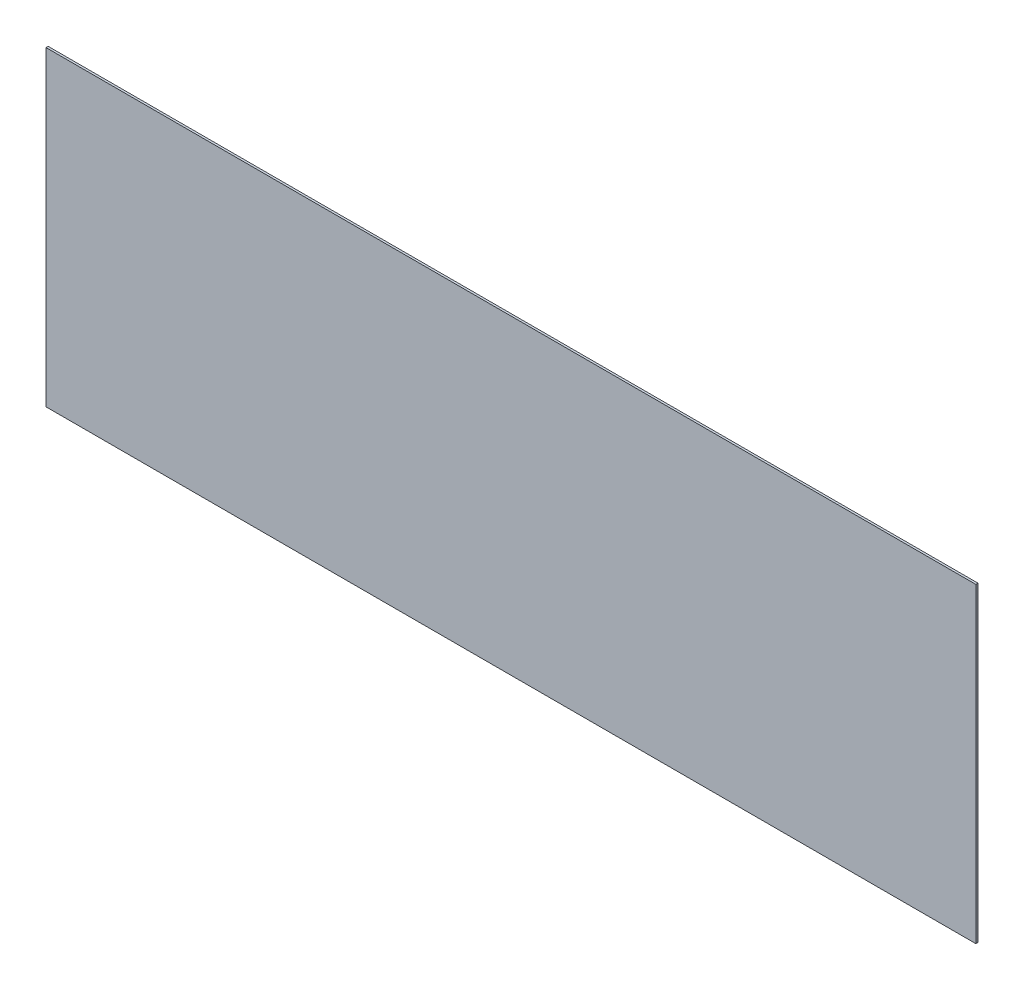
ISO-10303-21;
HEADER;
FILE_DESCRIPTION(('STEP AP214'),'2;1');
FILE_NAME('part.step','',(''),(''),'','','');
FILE_SCHEMA(('AUTOMOTIVE_DESIGN { 1 0 10303 214 1 1 1 1 }'));
ENDSEC;
DATA;
#1=APPLICATION_CONTEXT('core data for automotive mechanical design processes');
#2=APPLICATION_PROTOCOL_DEFINITION('international standard','automotive_design',2000,#1);
#3=PRODUCT_CONTEXT('',#1,'mechanical');
#4=PRODUCT('Part','Part','',(#3));
#5=PRODUCT_RELATED_PRODUCT_CATEGORY('part','',(#4));
#6=PRODUCT_DEFINITION_FORMATION('','',#4);
#7=PRODUCT_DEFINITION_CONTEXT('part definition',#1,'design');
#8=PRODUCT_DEFINITION('design','',#6,#7);
#9=PRODUCT_DEFINITION_SHAPE('','',#8);
#10=(LENGTH_UNIT() NAMED_UNIT(*) SI_UNIT(.MILLI.,.METRE.));
#11=(NAMED_UNIT(*) PLANE_ANGLE_UNIT() SI_UNIT($,.RADIAN.));
#12=(NAMED_UNIT(*) SI_UNIT($,.STERADIAN.) SOLID_ANGLE_UNIT());
#13=UNCERTAINTY_MEASURE_WITH_UNIT(LENGTH_MEASURE(1.E-05),#10,'distance_accuracy_value','');
#14=(GEOMETRIC_REPRESENTATION_CONTEXT(3) GLOBAL_UNCERTAINTY_ASSIGNED_CONTEXT((#13)) GLOBAL_UNIT_ASSIGNED_CONTEXT((#10,
#11,#12)) REPRESENTATION_CONTEXT('',''));
#15=CARTESIAN_POINT('',(0.,0.,0.));
#16=DIRECTION('',(0.,0.,1.));
#17=DIRECTION('',(1.,0.,0.));
#18=AXIS2_PLACEMENT_3D('',#15,#16,#17);
#19=CARTESIAN_POINT('',(650.,1070.,491.));
#20=DIRECTION('',(-1.,0.,0.));
#21=DIRECTION('',(0.,0.,1.));
#22=AXIS2_PLACEMENT_3D('',#19,#20,#21);
#23=PLANE('',#22);
#24=DIRECTION('',(0.,-1.,0.));
#25=VECTOR('',#24,1.);
#26=CARTESIAN_POINT('',(650.,1070.,494.));
#27=LINE('',#26,#25);
#28=CARTESIAN_POINT('',(650.,1070.,494.));
#29=VERTEX_POINT('',#28);
#30=CARTESIAN_POINT('',(650.,635.,494.000000000005));
#31=VERTEX_POINT('',#30);
#32=EDGE_CURVE('E97',#29,#31,#27,.T.);
#33=ORIENTED_EDGE('',*,*,#32,.T.);
#34=DIRECTION('',(0.,0.,1.));
#35=VECTOR('',#34,1.);
#36=CARTESIAN_POINT('',(650.,635.,491.000000000005));
#37=LINE('',#36,#35);
#38=CARTESIAN_POINT('',(650.,635.,491.000000000005));
#39=VERTEX_POINT('',#38);
#40=EDGE_CURVE('E11',#39,#31,#37,.T.);
#41=ORIENTED_EDGE('',*,*,#40,.F.);
#42=DIRECTION('',(0.,-1.,0.));
#43=VECTOR('',#42,1.);
#44=CARTESIAN_POINT('',(650.,1070.,491.));
#45=LINE('',#44,#43);
#46=CARTESIAN_POINT('',(650.,1070.,491.));
#47=VERTEX_POINT('',#46);
#48=EDGE_CURVE('E85',#47,#39,#45,.T.);
#49=ORIENTED_EDGE('',*,*,#48,.F.);
#50=DIRECTION('',(0.,0.,1.));
#51=VECTOR('',#50,1.);
#52=CARTESIAN_POINT('',(650.,1070.,491.));
#53=LINE('',#52,#51);
#54=EDGE_CURVE('E93',#47,#29,#53,.T.);
#55=ORIENTED_EDGE('',*,*,#54,.T.);
#56=EDGE_LOOP('',(#33,#41,#49,#55));
#57=FACE_BOUND('',#56,.T.);
#58=ADVANCED_FACE('F34',(#57),#23,.F.);
#59=CARTESIAN_POINT('',(650.,635.,491.000000000005));
#60=DIRECTION('',(0.,1.,0.));
#61=DIRECTION('',(0.,0.,1.));
#62=AXIS2_PLACEMENT_3D('',#59,#60,#61);
#63=PLANE('',#62);
#64=DIRECTION('',(-1.,0.,0.));
#65=VECTOR('',#64,1.);
#66=CARTESIAN_POINT('',(650.,635.,494.000000000005));
#67=LINE('',#66,#65);
#68=CARTESIAN_POINT('',(-650.000000000003,635.,494.000000000005));
#69=VERTEX_POINT('',#68);
#70=EDGE_CURVE('E89',#31,#69,#67,.T.);
#71=ORIENTED_EDGE('',*,*,#70,.T.);
#72=DIRECTION('',(0.,0.,1.));
#73=VECTOR('',#72,1.);
#74=CARTESIAN_POINT('',(-650.000000000003,635.,491.000000000005));
#75=LINE('',#74,#73);
#76=CARTESIAN_POINT('',(-650.000000000003,635.,491.000000000005));
#77=VERTEX_POINT('',#76);
#78=EDGE_CURVE('E42',#77,#69,#75,.T.);
#79=ORIENTED_EDGE('',*,*,#78,.F.);
#80=DIRECTION('',(-1.,0.,0.));
#81=VECTOR('',#80,1.);
#82=CARTESIAN_POINT('',(650.,635.,491.000000000005));
#83=LINE('',#82,#81);
#84=EDGE_CURVE('E80',#39,#77,#83,.T.);
#85=ORIENTED_EDGE('',*,*,#84,.F.);
#86=ORIENTED_EDGE('',*,*,#40,.T.);
#87=EDGE_LOOP('',(#71,#79,#85,#86));
#88=FACE_BOUND('',#87,.T.);
#89=ADVANCED_FACE('F88',(#88),#63,.F.);
#90=CARTESIAN_POINT('',(-650.000000000003,1070.,491.));
#91=DIRECTION('',(1.,0.,0.));
#92=DIRECTION('',(0.,0.,-1.));
#93=AXIS2_PLACEMENT_3D('',#90,#91,#92);
#94=PLANE('',#93);
#95=DIRECTION('',(0.,1.,0.));
#96=VECTOR('',#95,1.);
#97=CARTESIAN_POINT('',(-650.000000000003,1070.,494.));
#98=LINE('',#97,#96);
#99=CARTESIAN_POINT('',(-650.000000000003,1070.,494.));
#100=VERTEX_POINT('',#99);
#101=EDGE_CURVE('E67',#69,#100,#98,.T.);
#102=ORIENTED_EDGE('',*,*,#101,.T.);
#103=DIRECTION('',(0.,0.,1.));
#104=VECTOR('',#103,1.);
#105=CARTESIAN_POINT('',(-650.000000000003,1070.,491.));
#106=LINE('',#105,#104);
#107=CARTESIAN_POINT('',(-650.000000000003,1070.,491.));
#108=VERTEX_POINT('',#107);
#109=EDGE_CURVE('E90',#108,#100,#106,.T.);
#110=ORIENTED_EDGE('',*,*,#109,.F.);
#111=DIRECTION('',(0.,1.,0.));
#112=VECTOR('',#111,1.);
#113=CARTESIAN_POINT('',(-650.000000000003,1070.,491.));
#114=LINE('',#113,#112);
#115=EDGE_CURVE('E83',#77,#108,#114,.T.);
#116=ORIENTED_EDGE('',*,*,#115,.F.);
#117=ORIENTED_EDGE('',*,*,#78,.T.);
#118=EDGE_LOOP('',(#102,#110,#116,#117));
#119=FACE_BOUND('',#118,.T.);
#120=ADVANCED_FACE('F91',(#119),#94,.F.);
#121=CARTESIAN_POINT('',(650.,1070.,491.));
#122=DIRECTION('',(0.,-1.,0.));
#123=DIRECTION('',(0.,0.,-1.));
#124=AXIS2_PLACEMENT_3D('',#121,#122,#123);
#125=PLANE('',#124);
#126=DIRECTION('',(1.,0.,0.));
#127=VECTOR('',#126,1.);
#128=CARTESIAN_POINT('',(650.,1070.,494.));
#129=LINE('',#128,#127);
#130=EDGE_CURVE('E73',#100,#29,#129,.T.);
#131=ORIENTED_EDGE('',*,*,#130,.T.);
#132=ORIENTED_EDGE('',*,*,#54,.F.);
#133=DIRECTION('',(1.,0.,0.));
#134=VECTOR('',#133,1.);
#135=CARTESIAN_POINT('',(650.,1070.,491.));
#136=LINE('',#135,#134);
#137=EDGE_CURVE('E50',#108,#47,#136,.T.);
#138=ORIENTED_EDGE('',*,*,#137,.F.);
#139=ORIENTED_EDGE('',*,*,#109,.T.);
#140=EDGE_LOOP('',(#131,#132,#138,#139));
#141=FACE_BOUND('',#140,.T.);
#142=ADVANCED_FACE('F104',(#141),#125,.F.);
#143=CARTESIAN_POINT('',(0.,5.2631487105763E-12,491.000000000011));
#144=DIRECTION('',(0.,0.,-1.));
#145=DIRECTION('',(0.,1.,0.));
#146=AXIS2_PLACEMENT_3D('',#143,#144,#145);
#147=PLANE('',#146);
#148=ORIENTED_EDGE('',*,*,#48,.T.);
#149=ORIENTED_EDGE('',*,*,#84,.T.);
#150=ORIENTED_EDGE('',*,*,#115,.T.);
#151=ORIENTED_EDGE('',*,*,#137,.T.);
#152=EDGE_LOOP('',(#148,#149,#150,#151));
#153=FACE_BOUND('',#152,.T.);
#154=ADVANCED_FACE('F81',(#153),#147,.T.);
#155=CARTESIAN_POINT('',(0.,5.29538099193639E-12,494.000000000011));
#156=DIRECTION('',(0.,0.,-1.));
#157=DIRECTION('',(0.,1.,0.));
#158=AXIS2_PLACEMENT_3D('',#155,#156,#157);
#159=PLANE('',#158);
#160=ORIENTED_EDGE('',*,*,#32,.F.);
#161=ORIENTED_EDGE('',*,*,#130,.F.);
#162=ORIENTED_EDGE('',*,*,#101,.F.);
#163=ORIENTED_EDGE('',*,*,#70,.F.);
#164=EDGE_LOOP('',(#160,#161,#162,#163));
#165=FACE_BOUND('',#164,.T.);
#166=ADVANCED_FACE('F107',(#165),#159,.F.);
#167=CLOSED_SHELL('',(#58,#89,#120,#142,#154,#166));
#168=MANIFOLD_SOLID_BREP('B2',#167);
#169=ADVANCED_BREP_SHAPE_REPRESENTATION('',(#18,#168),#14);
#170=SHAPE_DEFINITION_REPRESENTATION(#9,#169);
ENDSEC;
END-ISO-10303-21;
